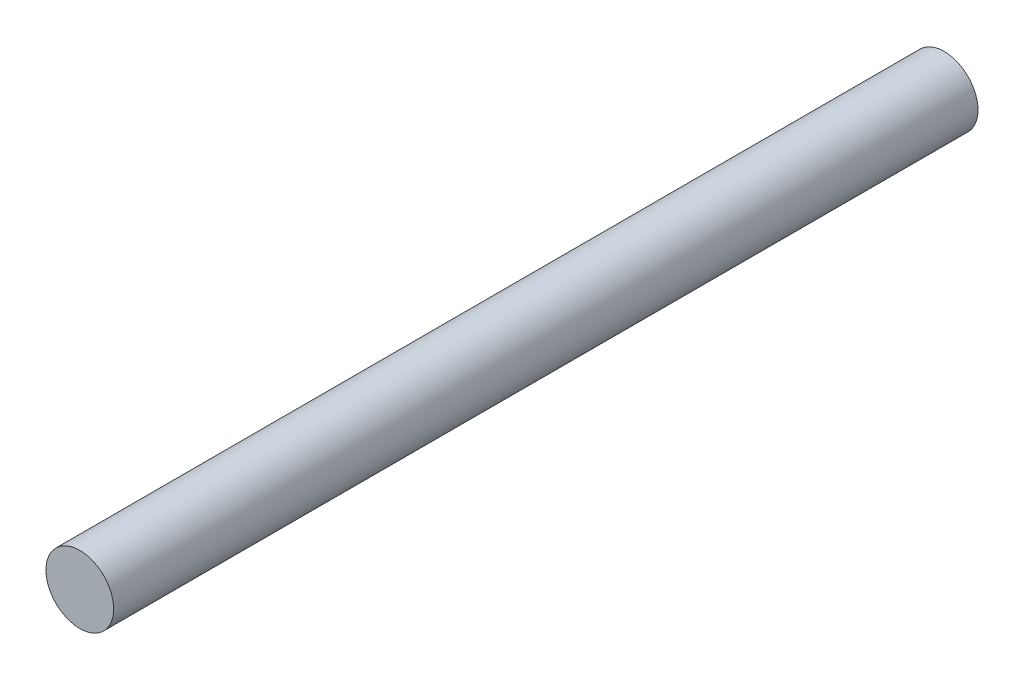
ISO-10303-21;
HEADER;
FILE_DESCRIPTION(('STEP AP214'),'2;1');
FILE_NAME('part.step','',(''),(''),'','','');
FILE_SCHEMA(('AUTOMOTIVE_DESIGN { 1 0 10303 214 1 1 1 1 }'));
ENDSEC;
DATA;
#1=APPLICATION_CONTEXT('core data for automotive mechanical design processes');
#2=APPLICATION_PROTOCOL_DEFINITION('international standard','automotive_design',2000,#1);
#3=PRODUCT_CONTEXT('',#1,'mechanical');
#4=PRODUCT('Part','Part','',(#3));
#5=PRODUCT_RELATED_PRODUCT_CATEGORY('part','',(#4));
#6=PRODUCT_DEFINITION_FORMATION('','',#4);
#7=PRODUCT_DEFINITION_CONTEXT('part definition',#1,'design');
#8=PRODUCT_DEFINITION('design','',#6,#7);
#9=PRODUCT_DEFINITION_SHAPE('','',#8);
#10=(LENGTH_UNIT() NAMED_UNIT(*) SI_UNIT(.MILLI.,.METRE.));
#11=(NAMED_UNIT(*) PLANE_ANGLE_UNIT() SI_UNIT($,.RADIAN.));
#12=(NAMED_UNIT(*) SI_UNIT($,.STERADIAN.) SOLID_ANGLE_UNIT());
#13=UNCERTAINTY_MEASURE_WITH_UNIT(LENGTH_MEASURE(1.E-05),#10,'distance_accuracy_value','');
#14=(GEOMETRIC_REPRESENTATION_CONTEXT(3) GLOBAL_UNCERTAINTY_ASSIGNED_CONTEXT((#13)) GLOBAL_UNIT_ASSIGNED_CONTEXT((#10,
#11,#12)) REPRESENTATION_CONTEXT('',''));
#15=CARTESIAN_POINT('',(0.,0.,0.));
#16=DIRECTION('',(0.,0.,1.));
#17=DIRECTION('',(1.,0.,0.));
#18=AXIS2_PLACEMENT_3D('',#15,#16,#17);
#19=CARTESIAN_POINT('',(0.,0.,1275.));
#20=DIRECTION('',(0.,0.,-1.));
#21=DIRECTION('',(-1.,0.,0.));
#22=AXIS2_PLACEMENT_3D('',#19,#20,#21);
#23=CYLINDRICAL_SURFACE('',#22,49.9499999999999);
#24=CARTESIAN_POINT('',(0.,0.,1275.));
#25=DIRECTION('',(0.,0.,1.));
#26=DIRECTION('',(1.,0.,0.));
#27=AXIS2_PLACEMENT_3D('',#24,#25,#26);
#28=CIRCLE('',#27,49.9499999999999);
#29=CARTESIAN_POINT('',(49.9499999999999,0.,1275.));
#30=VERTEX_POINT('',#29);
#31=EDGE_CURVE('E10',#30,#30,#28,.T.);
#32=ORIENTED_EDGE('',*,*,#31,.F.);
#33=EDGE_LOOP('',(#32));
#34=FACE_BOUND('',#33,.T.);
#35=CARTESIAN_POINT('',(0.,0.,0.));
#36=DIRECTION('',(0.,0.,1.));
#37=DIRECTION('',(1.,0.,0.));
#38=AXIS2_PLACEMENT_3D('',#35,#36,#37);
#39=CIRCLE('',#38,49.9499999999999);
#40=CARTESIAN_POINT('',(49.9499999999999,0.,0.));
#41=VERTEX_POINT('',#40);
#42=EDGE_CURVE('E40',#41,#41,#39,.T.);
#43=ORIENTED_EDGE('',*,*,#42,.T.);
#44=EDGE_LOOP('',(#43));
#45=FACE_BOUND('',#44,.T.);
#46=ADVANCED_FACE('F37',(#34,#45),#23,.T.);
#47=CARTESIAN_POINT('',(0.,0.,1275.));
#48=DIRECTION('',(0.,0.,1.));
#49=DIRECTION('',(1.,0.,0.));
#50=AXIS2_PLACEMENT_3D('',#47,#48,#49);
#51=PLANE('',#50);
#52=ORIENTED_EDGE('',*,*,#31,.T.);
#53=EDGE_LOOP('',(#52));
#54=FACE_BOUND('',#53,.T.);
#55=ADVANCED_FACE('F52',(#54),#51,.T.);
#56=CARTESIAN_POINT('',(0.,0.,0.));
#57=DIRECTION('',(0.,0.,1.));
#58=DIRECTION('',(1.,0.,0.));
#59=AXIS2_PLACEMENT_3D('',#56,#57,#58);
#60=PLANE('',#59);
#61=ORIENTED_EDGE('',*,*,#42,.F.);
#62=EDGE_LOOP('',(#61));
#63=FACE_BOUND('',#62,.T.);
#64=ADVANCED_FACE('F50',(#63),#60,.F.);
#65=CLOSED_SHELL('',(#46,#55,#64));
#66=MANIFOLD_SOLID_BREP('B2',#65);
#67=ADVANCED_BREP_SHAPE_REPRESENTATION('',(#18,#66),#14);
#68=SHAPE_DEFINITION_REPRESENTATION(#9,#67);
ENDSEC;
END-ISO-10303-21;
